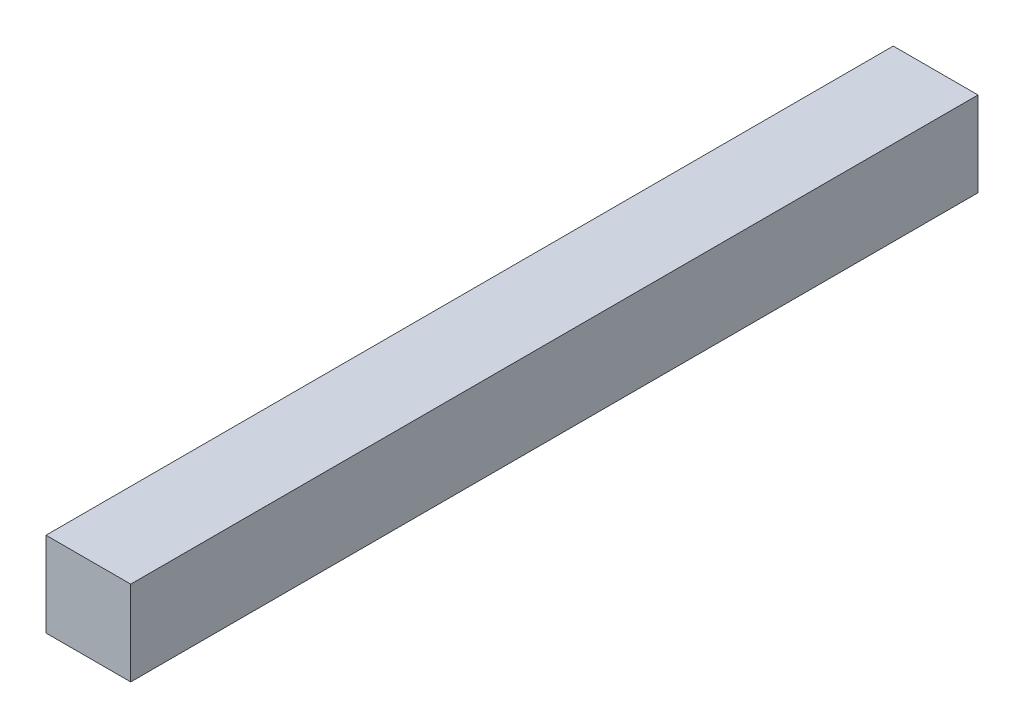
ISO-10303-21;
HEADER;
FILE_DESCRIPTION(('STEP AP214'),'2;1');
FILE_NAME('part.step','',(''),(''),'','','');
FILE_SCHEMA(('AUTOMOTIVE_DESIGN { 1 0 10303 214 1 1 1 1 }'));
ENDSEC;
DATA;
#1=APPLICATION_CONTEXT('core data for automotive mechanical design processes');
#2=APPLICATION_PROTOCOL_DEFINITION('international standard','automotive_design',2000,#1);
#3=PRODUCT_CONTEXT('',#1,'mechanical');
#4=PRODUCT('Part','Part','',(#3));
#5=PRODUCT_RELATED_PRODUCT_CATEGORY('part','',(#4));
#6=PRODUCT_DEFINITION_FORMATION('','',#4);
#7=PRODUCT_DEFINITION_CONTEXT('part definition',#1,'design');
#8=PRODUCT_DEFINITION('design','',#6,#7);
#9=PRODUCT_DEFINITION_SHAPE('','',#8);
#10=(LENGTH_UNIT() NAMED_UNIT(*) SI_UNIT(.MILLI.,.METRE.));
#11=(NAMED_UNIT(*) PLANE_ANGLE_UNIT() SI_UNIT($,.RADIAN.));
#12=(NAMED_UNIT(*) SI_UNIT($,.STERADIAN.) SOLID_ANGLE_UNIT());
#13=UNCERTAINTY_MEASURE_WITH_UNIT(LENGTH_MEASURE(1.E-05),#10,'distance_accuracy_value','');
#14=(GEOMETRIC_REPRESENTATION_CONTEXT(3) GLOBAL_UNCERTAINTY_ASSIGNED_CONTEXT((#13)) GLOBAL_UNIT_ASSIGNED_CONTEXT((#10,
#11,#12)) REPRESENTATION_CONTEXT('',''));
#15=CARTESIAN_POINT('',(0.,0.,0.));
#16=DIRECTION('',(0.,0.,1.));
#17=DIRECTION('',(1.,0.,0.));
#18=AXIS2_PLACEMENT_3D('',#15,#16,#17);
#19=CARTESIAN_POINT('',(0.,0.,10000.));
#20=DIRECTION('',(-1.,0.,0.));
#21=DIRECTION('',(0.,-1.,0.));
#22=AXIS2_PLACEMENT_3D('',#19,#20,#21);
#23=PLANE('',#22);
#24=DIRECTION('',(0.,1.,0.));
#25=VECTOR('',#24,1.);
#26=CARTESIAN_POINT('',(0.,0.,0.));
#27=LINE('',#26,#25);
#28=CARTESIAN_POINT('',(1.22464679914735E-13,-1000.,0.));
#29=VERTEX_POINT('',#28);
#30=CARTESIAN_POINT('',(0.,0.,0.));
#31=VERTEX_POINT('',#30);
#32=EDGE_CURVE('E100',#29,#31,#27,.T.);
#33=ORIENTED_EDGE('',*,*,#32,.T.);
#34=DIRECTION('',(0.,0.,-1.));
#35=VECTOR('',#34,1.);
#36=CARTESIAN_POINT('',(0.,0.,10000.));
#37=LINE('',#36,#35);
#38=CARTESIAN_POINT('',(0.,0.,10000.));
#39=VERTEX_POINT('',#38);
#40=EDGE_CURVE('E11',#39,#31,#37,.T.);
#41=ORIENTED_EDGE('',*,*,#40,.F.);
#42=DIRECTION('',(0.,1.,0.));
#43=VECTOR('',#42,1.);
#44=CARTESIAN_POINT('',(0.,0.,10000.));
#45=LINE('',#44,#43);
#46=CARTESIAN_POINT('',(1.22464679914735E-13,-1000.,10000.));
#47=VERTEX_POINT('',#46);
#48=EDGE_CURVE('E88',#47,#39,#45,.T.);
#49=ORIENTED_EDGE('',*,*,#48,.F.);
#50=DIRECTION('',(0.,0.,-1.));
#51=VECTOR('',#50,1.);
#52=CARTESIAN_POINT('',(1.22464679914735E-13,-1000.,10000.));
#53=LINE('',#52,#51);
#54=EDGE_CURVE('E96',#47,#29,#53,.T.);
#55=ORIENTED_EDGE('',*,*,#54,.T.);
#56=EDGE_LOOP('',(#33,#41,#49,#55));
#57=FACE_BOUND('',#56,.T.);
#58=ADVANCED_FACE('F37',(#57),#23,.F.);
#59=CARTESIAN_POINT('',(0.,0.,10000.));
#60=DIRECTION('',(0.,-1.,0.));
#61=DIRECTION('',(0.,0.,-1.));
#62=AXIS2_PLACEMENT_3D('',#59,#60,#61);
#63=PLANE('',#62);
#64=DIRECTION('',(-1.,0.,0.));
#65=VECTOR('',#64,1.);
#66=CARTESIAN_POINT('',(0.,0.,0.));
#67=LINE('',#66,#65);
#68=CARTESIAN_POINT('',(-1000.,0.,0.));
#69=VERTEX_POINT('',#68);
#70=EDGE_CURVE('E92',#31,#69,#67,.T.);
#71=ORIENTED_EDGE('',*,*,#70,.T.);
#72=DIRECTION('',(0.,0.,-1.));
#73=VECTOR('',#72,1.);
#74=CARTESIAN_POINT('',(-1000.,0.,10000.));
#75=LINE('',#74,#73);
#76=CARTESIAN_POINT('',(-1000.,0.,10000.));
#77=VERTEX_POINT('',#76);
#78=EDGE_CURVE('E45',#77,#69,#75,.T.);
#79=ORIENTED_EDGE('',*,*,#78,.F.);
#80=DIRECTION('',(-1.,0.,0.));
#81=VECTOR('',#80,1.);
#82=CARTESIAN_POINT('',(0.,0.,10000.));
#83=LINE('',#82,#81);
#84=EDGE_CURVE('E83',#39,#77,#83,.T.);
#85=ORIENTED_EDGE('',*,*,#84,.F.);
#86=ORIENTED_EDGE('',*,*,#40,.T.);
#87=EDGE_LOOP('',(#71,#79,#85,#86));
#88=FACE_BOUND('',#87,.T.);
#89=ADVANCED_FACE('F91',(#88),#63,.F.);
#90=CARTESIAN_POINT('',(-1000.,0.,10000.));
#91=DIRECTION('',(1.,0.,0.));
#92=DIRECTION('',(0.,1.,0.));
#93=AXIS2_PLACEMENT_3D('',#90,#91,#92);
#94=PLANE('',#93);
#95=DIRECTION('',(0.,-1.,0.));
#96=VECTOR('',#95,1.);
#97=CARTESIAN_POINT('',(-1000.,0.,0.));
#98=LINE('',#97,#96);
#99=CARTESIAN_POINT('',(-1000.,-1000.,0.));
#100=VERTEX_POINT('',#99);
#101=EDGE_CURVE('E70',#69,#100,#98,.T.);
#102=ORIENTED_EDGE('',*,*,#101,.T.);
#103=DIRECTION('',(0.,0.,-1.));
#104=VECTOR('',#103,1.);
#105=CARTESIAN_POINT('',(-1000.,-1000.,10000.));
#106=LINE('',#105,#104);
#107=CARTESIAN_POINT('',(-1000.,-1000.,10000.));
#108=VERTEX_POINT('',#107);
#109=EDGE_CURVE('E93',#108,#100,#106,.T.);
#110=ORIENTED_EDGE('',*,*,#109,.F.);
#111=DIRECTION('',(0.,-1.,0.));
#112=VECTOR('',#111,1.);
#113=CARTESIAN_POINT('',(-1000.,0.,10000.));
#114=LINE('',#113,#112);
#115=EDGE_CURVE('E86',#77,#108,#114,.T.);
#116=ORIENTED_EDGE('',*,*,#115,.F.);
#117=ORIENTED_EDGE('',*,*,#78,.T.);
#118=EDGE_LOOP('',(#102,#110,#116,#117));
#119=FACE_BOUND('',#118,.T.);
#120=ADVANCED_FACE('F94',(#119),#94,.F.);
#121=CARTESIAN_POINT('',(1.22464679914735E-13,-1000.,10000.));
#122=DIRECTION('',(0.,1.,0.));
#123=DIRECTION('',(-1.,0.,0.));
#124=AXIS2_PLACEMENT_3D('',#121,#122,#123);
#125=PLANE('',#124);
#126=DIRECTION('',(1.,0.,0.));
#127=VECTOR('',#126,1.);
#128=CARTESIAN_POINT('',(1.22464679914735E-13,-1000.,0.));
#129=LINE('',#128,#127);
#130=EDGE_CURVE('E76',#100,#29,#129,.T.);
#131=ORIENTED_EDGE('',*,*,#130,.T.);
#132=ORIENTED_EDGE('',*,*,#54,.F.);
#133=DIRECTION('',(1.,0.,0.));
#134=VECTOR('',#133,1.);
#135=CARTESIAN_POINT('',(1.22464679914735E-13,-1000.,10000.));
#136=LINE('',#135,#134);
#137=EDGE_CURVE('E53',#108,#47,#136,.T.);
#138=ORIENTED_EDGE('',*,*,#137,.F.);
#139=ORIENTED_EDGE('',*,*,#109,.T.);
#140=EDGE_LOOP('',(#131,#132,#138,#139));
#141=FACE_BOUND('',#140,.T.);
#142=ADVANCED_FACE('F107',(#141),#125,.F.);
#143=CARTESIAN_POINT('',(0.,0.,10000.));
#144=DIRECTION('',(0.,0.,-1.));
#145=DIRECTION('',(-1.,0.,0.));
#146=AXIS2_PLACEMENT_3D('',#143,#144,#145);
#147=PLANE('',#146);
#148=ORIENTED_EDGE('',*,*,#48,.T.);
#149=ORIENTED_EDGE('',*,*,#84,.T.);
#150=ORIENTED_EDGE('',*,*,#115,.T.);
#151=ORIENTED_EDGE('',*,*,#137,.T.);
#152=EDGE_LOOP('',(#148,#149,#150,#151));
#153=FACE_BOUND('',#152,.T.);
#154=ADVANCED_FACE('F84',(#153),#147,.F.);
#155=CARTESIAN_POINT('',(0.,0.,0.));
#156=DIRECTION('',(0.,0.,-1.));
#157=DIRECTION('',(-1.,0.,0.));
#158=AXIS2_PLACEMENT_3D('',#155,#156,#157);
#159=PLANE('',#158);
#160=ORIENTED_EDGE('',*,*,#32,.F.);
#161=ORIENTED_EDGE('',*,*,#130,.F.);
#162=ORIENTED_EDGE('',*,*,#101,.F.);
#163=ORIENTED_EDGE('',*,*,#70,.F.);
#164=EDGE_LOOP('',(#160,#161,#162,#163));
#165=FACE_BOUND('',#164,.T.);
#166=ADVANCED_FACE('F110',(#165),#159,.T.);
#167=CLOSED_SHELL('',(#58,#89,#120,#142,#154,#166));
#168=MANIFOLD_SOLID_BREP('B2',#167);
#169=ADVANCED_BREP_SHAPE_REPRESENTATION('',(#18,#168),#14);
#170=SHAPE_DEFINITION_REPRESENTATION(#9,#169);
ENDSEC;
END-ISO-10303-21;
